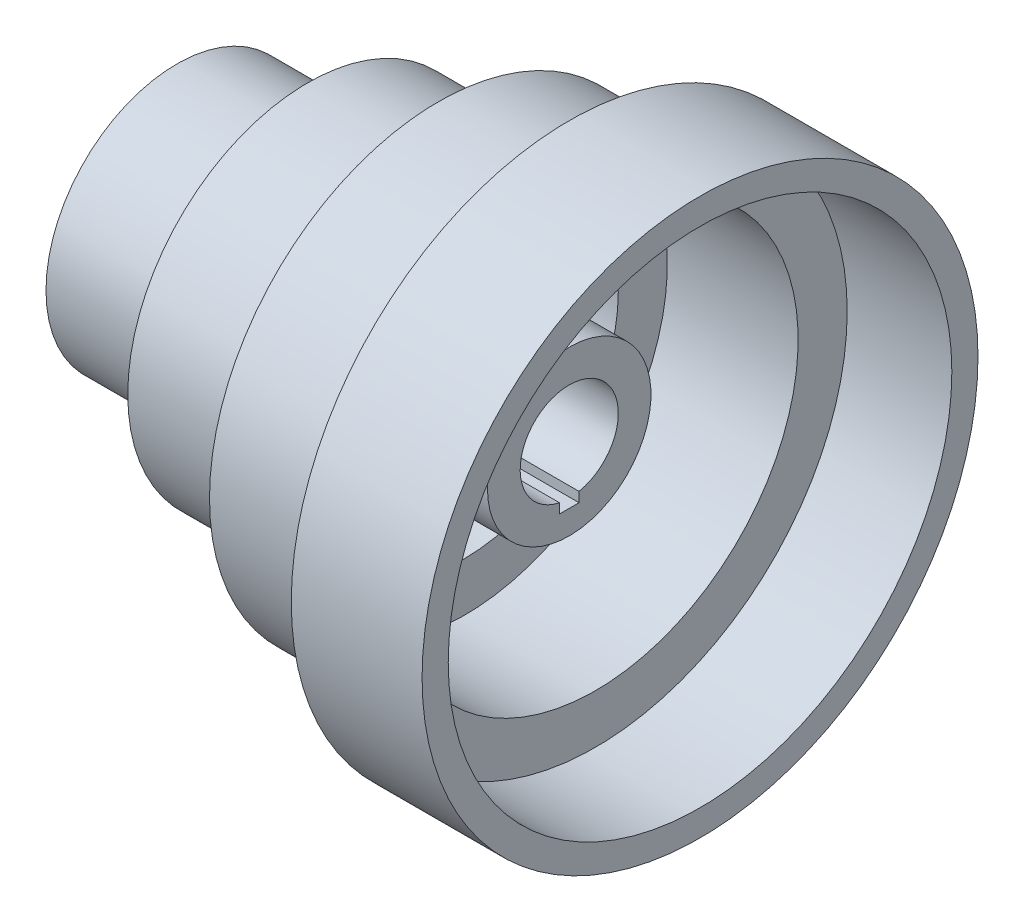
ISO-10303-21;
HEADER;
FILE_DESCRIPTION(('STEP AP214'),'2;1');
FILE_NAME('part.step','',(''),(''),'','','');
FILE_SCHEMA(('AUTOMOTIVE_DESIGN { 1 0 10303 214 1 1 1 1 }'));
ENDSEC;
DATA;
#1=APPLICATION_CONTEXT('core data for automotive mechanical design processes');
#2=APPLICATION_PROTOCOL_DEFINITION('international standard','automotive_design',2000,#1);
#3=PRODUCT_CONTEXT('',#1,'mechanical');
#4=PRODUCT('Part','Part','',(#3));
#5=PRODUCT_RELATED_PRODUCT_CATEGORY('part','',(#4));
#6=PRODUCT_DEFINITION_FORMATION('','',#4);
#7=PRODUCT_DEFINITION_CONTEXT('part definition',#1,'design');
#8=PRODUCT_DEFINITION('design','',#6,#7);
#9=PRODUCT_DEFINITION_SHAPE('','',#8);
#10=(LENGTH_UNIT() NAMED_UNIT(*) SI_UNIT(.MILLI.,.METRE.));
#11=(NAMED_UNIT(*) PLANE_ANGLE_UNIT() SI_UNIT($,.RADIAN.));
#12=(NAMED_UNIT(*) SI_UNIT($,.STERADIAN.) SOLID_ANGLE_UNIT());
#13=UNCERTAINTY_MEASURE_WITH_UNIT(LENGTH_MEASURE(1.E-05),#10,'distance_accuracy_value','');
#14=(GEOMETRIC_REPRESENTATION_CONTEXT(3) GLOBAL_UNCERTAINTY_ASSIGNED_CONTEXT((#13)) GLOBAL_UNIT_ASSIGNED_CONTEXT((#10,
#11,#12)) REPRESENTATION_CONTEXT('',''));
#15=CARTESIAN_POINT('',(0.,0.,0.));
#16=DIRECTION('',(0.,0.,1.));
#17=DIRECTION('',(1.,0.,0.));
#18=AXIS2_PLACEMENT_3D('',#15,#16,#17);
#19=CARTESIAN_POINT('',(-111.650485436893,0.,0.));
#20=DIRECTION('',(-1.,0.,0.));
#21=DIRECTION('',(0.,0.,1.));
#22=AXIS2_PLACEMENT_3D('',#19,#20,#21);
#23=CYLINDRICAL_SURFACE('',#22,25.);
#24=CARTESIAN_POINT('',(48.,0.,0.));
#25=DIRECTION('',(-1.,0.,0.));
#26=DIRECTION('',(0.,0.,1.));
#27=AXIS2_PLACEMENT_3D('',#24,#25,#26);
#28=CIRCLE('',#27,25.);
#29=CARTESIAN_POINT('',(48.,0.,25.));
#30=VERTEX_POINT('',#29);
#31=EDGE_CURVE('E88',#30,#30,#28,.T.);
#32=ORIENTED_EDGE('',*,*,#31,.F.);
#33=EDGE_LOOP('',(#32));
#34=FACE_BOUND('',#33,.T.);
#35=CARTESIAN_POINT('',(120.,0.,0.));
#36=DIRECTION('',(-1.,0.,0.));
#37=DIRECTION('',(0.,0.,1.));
#38=AXIS2_PLACEMENT_3D('',#35,#36,#37);
#39=CIRCLE('',#38,25.);
#40=CARTESIAN_POINT('',(120.,0.,25.));
#41=VERTEX_POINT('',#40);
#42=EDGE_CURVE('E147',#41,#41,#39,.T.);
#43=ORIENTED_EDGE('',*,*,#42,.T.);
#44=EDGE_LOOP('',(#43));
#45=FACE_BOUND('',#44,.T.);
#46=ADVANCED_FACE('F37',(#34,#45),#23,.T.);
#47=CARTESIAN_POINT('',(120.,15.,0.));
#48=DIRECTION('',(-1.,0.,0.));
#49=DIRECTION('',(0.,0.,1.));
#50=AXIS2_PLACEMENT_3D('',#47,#48,#49);
#51=PLANE('',#50);
#52=ORIENTED_EDGE('',*,*,#42,.F.);
#53=EDGE_LOOP('',(#52));
#54=FACE_BOUND('',#53,.T.);
#55=DIRECTION('',(0.,0.,1.));
#56=VECTOR('',#55,1.);
#57=CARTESIAN_POINT('',(120.,-17.6969384566991,0.));
#58=LINE('',#57,#56);
#59=CARTESIAN_POINT('',(120.,-17.6969384566991,-3.));
#60=VERTEX_POINT('',#59);
#61=CARTESIAN_POINT('',(120.,-17.6969384566991,3.));
#62=VERTEX_POINT('',#61);
#63=EDGE_CURVE('E77',#60,#62,#58,.T.);
#64=ORIENTED_EDGE('',*,*,#63,.T.);
#65=DIRECTION('',(0.,1.,0.));
#66=VECTOR('',#65,1.);
#67=CARTESIAN_POINT('',(120.,15.,3.));
#68=LINE('',#67,#66);
#69=CARTESIAN_POINT('',(120.,-14.6969384566991,3.));
#70=VERTEX_POINT('',#69);
#71=EDGE_CURVE('E82',#62,#70,#68,.T.);
#72=ORIENTED_EDGE('',*,*,#71,.T.);
#73=CARTESIAN_POINT('',(120.,0.,0.));
#74=DIRECTION('',(-1.,0.,0.));
#75=DIRECTION('',(0.,0.,1.));
#76=AXIS2_PLACEMENT_3D('',#73,#74,#75);
#77=CIRCLE('',#76,15.);
#78=CARTESIAN_POINT('',(120.,-14.6969384566991,-3.));
#79=VERTEX_POINT('',#78);
#80=EDGE_CURVE('E145',#70,#79,#77,.T.);
#81=ORIENTED_EDGE('',*,*,#80,.T.);
#82=DIRECTION('',(0.,-1.,0.));
#83=VECTOR('',#82,1.);
#84=CARTESIAN_POINT('',(120.,15.,-3.));
#85=LINE('',#84,#83);
#86=EDGE_CURVE('E96',#79,#60,#85,.T.);
#87=ORIENTED_EDGE('',*,*,#86,.T.);
#88=EDGE_LOOP('',(#64,#72,#81,#87));
#89=FACE_BOUND('',#88,.T.);
#90=ADVANCED_FACE('F95',(#54,#89),#51,.F.);
#91=CARTESIAN_POINT('',(-111.650485436893,0.,0.));
#92=DIRECTION('',(-1.,0.,0.));
#93=DIRECTION('',(0.,0.,1.));
#94=AXIS2_PLACEMENT_3D('',#91,#92,#93);
#95=CYLINDRICAL_SURFACE('',#94,15.);
#96=ORIENTED_EDGE('',*,*,#80,.F.);
#97=DIRECTION('',(-1.,0.,0.));
#98=VECTOR('',#97,1.);
#99=CARTESIAN_POINT('',(160.,-14.6969384566991,3.));
#100=LINE('',#99,#98);
#101=CARTESIAN_POINT('',(0.,-14.6969384566991,3.));
#102=VERTEX_POINT('',#101);
#103=EDGE_CURVE('E61',#70,#102,#100,.T.);
#104=ORIENTED_EDGE('',*,*,#103,.T.);
#105=CARTESIAN_POINT('',(0.,0.,0.));
#106=DIRECTION('',(-1.,0.,0.));
#107=DIRECTION('',(0.,0.,1.));
#108=AXIS2_PLACEMENT_3D('',#105,#106,#107);
#109=CIRCLE('',#108,15.);
#110=CARTESIAN_POINT('',(0.,-14.6969384566991,-3.));
#111=VERTEX_POINT('',#110);
#112=EDGE_CURVE('E40',#102,#111,#109,.T.);
#113=ORIENTED_EDGE('',*,*,#112,.T.);
#114=DIRECTION('',(-1.,0.,0.));
#115=VECTOR('',#114,1.);
#116=CARTESIAN_POINT('',(160.,-14.6969384566991,-3.));
#117=LINE('',#116,#115);
#118=EDGE_CURVE('E52',#79,#111,#117,.T.);
#119=ORIENTED_EDGE('',*,*,#118,.F.);
#120=EDGE_LOOP('',(#96,#104,#113,#119));
#121=FACE_BOUND('',#120,.T.);
#122=ADVANCED_FACE('F158',(#121),#95,.F.);
#123=CARTESIAN_POINT('',(0.,40.,0.));
#124=DIRECTION('',(1.,0.,0.));
#125=DIRECTION('',(0.,0.,-1.));
#126=AXIS2_PLACEMENT_3D('',#123,#124,#125);
#127=PLANE('',#126);
#128=ORIENTED_EDGE('',*,*,#112,.F.);
#129=DIRECTION('',(0.,-1.,0.));
#130=VECTOR('',#129,1.);
#131=CARTESIAN_POINT('',(0.,40.,3.));
#132=LINE('',#131,#130);
#133=CARTESIAN_POINT('',(0.,-17.6969384566991,3.));
#134=VERTEX_POINT('',#133);
#135=EDGE_CURVE('E11',#102,#134,#132,.T.);
#136=ORIENTED_EDGE('',*,*,#135,.T.);
#137=DIRECTION('',(0.,0.,-1.));
#138=VECTOR('',#137,1.);
#139=CARTESIAN_POINT('',(0.,-17.6969384566991,0.));
#140=LINE('',#139,#138);
#141=CARTESIAN_POINT('',(0.,-17.6969384566991,-3.));
#142=VERTEX_POINT('',#141);
#143=EDGE_CURVE('E45',#134,#142,#140,.T.);
#144=ORIENTED_EDGE('',*,*,#143,.T.);
#145=DIRECTION('',(0.,1.,0.));
#146=VECTOR('',#145,1.);
#147=CARTESIAN_POINT('',(0.,40.,-3.));
#148=LINE('',#147,#146);
#149=EDGE_CURVE('E150',#142,#111,#148,.T.);
#150=ORIENTED_EDGE('',*,*,#149,.T.);
#151=EDGE_LOOP('',(#128,#136,#144,#150));
#152=FACE_BOUND('',#151,.T.);
#153=CARTESIAN_POINT('',(0.,0.,0.));
#154=DIRECTION('',(-1.,0.,0.));
#155=DIRECTION('',(0.,0.,1.));
#156=AXIS2_PLACEMENT_3D('',#153,#154,#155);
#157=CIRCLE('',#156,40.);
#158=CARTESIAN_POINT('',(0.,0.,40.));
#159=VERTEX_POINT('',#158);
#160=EDGE_CURVE('E142',#159,#159,#157,.T.);
#161=ORIENTED_EDGE('',*,*,#160,.T.);
#162=EDGE_LOOP('',(#161));
#163=FACE_BOUND('',#162,.T.);
#164=ADVANCED_FACE('F154',(#152,#163),#127,.F.);
#165=CARTESIAN_POINT('',(-111.650485436893,0.,0.));
#166=DIRECTION('',(-1.,0.,0.));
#167=DIRECTION('',(0.,0.,1.));
#168=AXIS2_PLACEMENT_3D('',#165,#166,#167);
#169=CYLINDRICAL_SURFACE('',#168,40.);
#170=ORIENTED_EDGE('',*,*,#160,.F.);
#171=EDGE_LOOP('',(#170));
#172=FACE_BOUND('',#171,.T.);
#173=CARTESIAN_POINT('',(40.,0.,0.));
#174=DIRECTION('',(-1.,0.,0.));
#175=DIRECTION('',(0.,0.,1.));
#176=AXIS2_PLACEMENT_3D('',#173,#174,#175);
#177=CIRCLE('',#176,40.);
#178=CARTESIAN_POINT('',(40.,0.,40.));
#179=VERTEX_POINT('',#178);
#180=EDGE_CURVE('E139',#179,#179,#177,.T.);
#181=ORIENTED_EDGE('',*,*,#180,.T.);
#182=EDGE_LOOP('',(#181));
#183=FACE_BOUND('',#182,.T.);
#184=ADVANCED_FACE('F235',(#172,#183),#169,.T.);
#185=CARTESIAN_POINT('',(40.,55.,0.));
#186=DIRECTION('',(1.,0.,0.));
#187=DIRECTION('',(0.,0.,-1.));
#188=AXIS2_PLACEMENT_3D('',#185,#186,#187);
#189=PLANE('',#188);
#190=ORIENTED_EDGE('',*,*,#180,.F.);
#191=EDGE_LOOP('',(#190));
#192=FACE_BOUND('',#191,.T.);
#193=CARTESIAN_POINT('',(40.,0.,0.));
#194=DIRECTION('',(-1.,0.,0.));
#195=DIRECTION('',(0.,0.,1.));
#196=AXIS2_PLACEMENT_3D('',#193,#194,#195);
#197=CIRCLE('',#196,55.);
#198=CARTESIAN_POINT('',(40.,0.,55.));
#199=VERTEX_POINT('',#198);
#200=EDGE_CURVE('E136',#199,#199,#197,.T.);
#201=ORIENTED_EDGE('',*,*,#200,.T.);
#202=EDGE_LOOP('',(#201));
#203=FACE_BOUND('',#202,.T.);
#204=ADVANCED_FACE('F231',(#192,#203),#189,.F.);
#205=CARTESIAN_POINT('',(-111.650485436893,0.,0.));
#206=DIRECTION('',(-1.,0.,0.));
#207=DIRECTION('',(0.,0.,1.));
#208=AXIS2_PLACEMENT_3D('',#205,#206,#207);
#209=CYLINDRICAL_SURFACE('',#208,55.);
#210=ORIENTED_EDGE('',*,*,#200,.F.);
#211=EDGE_LOOP('',(#210));
#212=FACE_BOUND('',#211,.T.);
#213=CARTESIAN_POINT('',(80.,0.,0.));
#214=DIRECTION('',(-1.,0.,0.));
#215=DIRECTION('',(0.,0.,1.));
#216=AXIS2_PLACEMENT_3D('',#213,#214,#215);
#217=CIRCLE('',#216,55.);
#218=CARTESIAN_POINT('',(80.,0.,55.));
#219=VERTEX_POINT('',#218);
#220=EDGE_CURVE('E133',#219,#219,#217,.T.);
#221=ORIENTED_EDGE('',*,*,#220,.T.);
#222=EDGE_LOOP('',(#221));
#223=FACE_BOUND('',#222,.T.);
#224=ADVANCED_FACE('F227',(#212,#223),#209,.T.);
#225=CARTESIAN_POINT('',(80.,70.,0.));
#226=DIRECTION('',(1.,0.,0.));
#227=DIRECTION('',(0.,0.,-1.));
#228=AXIS2_PLACEMENT_3D('',#225,#226,#227);
#229=PLANE('',#228);
#230=ORIENTED_EDGE('',*,*,#220,.F.);
#231=EDGE_LOOP('',(#230));
#232=FACE_BOUND('',#231,.T.);
#233=CARTESIAN_POINT('',(80.,0.,0.));
#234=DIRECTION('',(-1.,0.,0.));
#235=DIRECTION('',(0.,0.,1.));
#236=AXIS2_PLACEMENT_3D('',#233,#234,#235);
#237=CIRCLE('',#236,70.);
#238=CARTESIAN_POINT('',(80.,0.,70.));
#239=VERTEX_POINT('',#238);
#240=EDGE_CURVE('E130',#239,#239,#237,.T.);
#241=ORIENTED_EDGE('',*,*,#240,.T.);
#242=EDGE_LOOP('',(#241));
#243=FACE_BOUND('',#242,.T.);
#244=ADVANCED_FACE('F223',(#232,#243),#229,.F.);
#245=CARTESIAN_POINT('',(-111.650485436893,0.,0.));
#246=DIRECTION('',(-1.,0.,0.));
#247=DIRECTION('',(0.,0.,1.));
#248=AXIS2_PLACEMENT_3D('',#245,#246,#247);
#249=CYLINDRICAL_SURFACE('',#248,70.);
#250=ORIENTED_EDGE('',*,*,#240,.F.);
#251=EDGE_LOOP('',(#250));
#252=FACE_BOUND('',#251,.T.);
#253=CARTESIAN_POINT('',(120.,0.,0.));
#254=DIRECTION('',(-1.,0.,0.));
#255=DIRECTION('',(0.,0.,1.));
#256=AXIS2_PLACEMENT_3D('',#253,#254,#255);
#257=CIRCLE('',#256,70.);
#258=CARTESIAN_POINT('',(120.,0.,70.));
#259=VERTEX_POINT('',#258);
#260=EDGE_CURVE('E127',#259,#259,#257,.T.);
#261=ORIENTED_EDGE('',*,*,#260,.T.);
#262=EDGE_LOOP('',(#261));
#263=FACE_BOUND('',#262,.T.);
#264=ADVANCED_FACE('F219',(#252,#263),#249,.T.);
#265=CARTESIAN_POINT('',(120.,85.,0.));
#266=DIRECTION('',(1.,0.,0.));
#267=DIRECTION('',(0.,0.,-1.));
#268=AXIS2_PLACEMENT_3D('',#265,#266,#267);
#269=PLANE('',#268);
#270=ORIENTED_EDGE('',*,*,#260,.F.);
#271=EDGE_LOOP('',(#270));
#272=FACE_BOUND('',#271,.T.);
#273=CARTESIAN_POINT('',(120.,0.,0.));
#274=DIRECTION('',(-1.,0.,0.));
#275=DIRECTION('',(0.,0.,1.));
#276=AXIS2_PLACEMENT_3D('',#273,#274,#275);
#277=CIRCLE('',#276,85.);
#278=CARTESIAN_POINT('',(120.,0.,85.));
#279=VERTEX_POINT('',#278);
#280=EDGE_CURVE('E124',#279,#279,#277,.T.);
#281=ORIENTED_EDGE('',*,*,#280,.T.);
#282=EDGE_LOOP('',(#281));
#283=FACE_BOUND('',#282,.T.);
#284=ADVANCED_FACE('F215',(#272,#283),#269,.F.);
#285=CARTESIAN_POINT('',(-111.650485436893,0.,0.));
#286=DIRECTION('',(-1.,0.,0.));
#287=DIRECTION('',(0.,0.,1.));
#288=AXIS2_PLACEMENT_3D('',#285,#286,#287);
#289=CYLINDRICAL_SURFACE('',#288,85.);
#290=ORIENTED_EDGE('',*,*,#280,.F.);
#291=EDGE_LOOP('',(#290));
#292=FACE_BOUND('',#291,.T.);
#293=CARTESIAN_POINT('',(160.,0.,0.));
#294=DIRECTION('',(-1.,0.,0.));
#295=DIRECTION('',(0.,0.,1.));
#296=AXIS2_PLACEMENT_3D('',#293,#294,#295);
#297=CIRCLE('',#296,85.);
#298=CARTESIAN_POINT('',(160.,0.,85.));
#299=VERTEX_POINT('',#298);
#300=EDGE_CURVE('E121',#299,#299,#297,.T.);
#301=ORIENTED_EDGE('',*,*,#300,.T.);
#302=EDGE_LOOP('',(#301));
#303=FACE_BOUND('',#302,.T.);
#304=ADVANCED_FACE('F211',(#292,#303),#289,.T.);
#305=CARTESIAN_POINT('',(160.,77.,0.));
#306=DIRECTION('',(-1.,0.,0.));
#307=DIRECTION('',(0.,0.,1.));
#308=AXIS2_PLACEMENT_3D('',#305,#306,#307);
#309=PLANE('',#308);
#310=ORIENTED_EDGE('',*,*,#300,.F.);
#311=EDGE_LOOP('',(#310));
#312=FACE_BOUND('',#311,.T.);
#313=CARTESIAN_POINT('',(160.,0.,0.));
#314=DIRECTION('',(-1.,0.,0.));
#315=DIRECTION('',(0.,0.,1.));
#316=AXIS2_PLACEMENT_3D('',#313,#314,#315);
#317=CIRCLE('',#316,77.);
#318=CARTESIAN_POINT('',(160.,0.,77.));
#319=VERTEX_POINT('',#318);
#320=EDGE_CURVE('E118',#319,#319,#317,.T.);
#321=ORIENTED_EDGE('',*,*,#320,.T.);
#322=EDGE_LOOP('',(#321));
#323=FACE_BOUND('',#322,.T.);
#324=ADVANCED_FACE('F207',(#312,#323),#309,.F.);
#325=CARTESIAN_POINT('',(-111.650485436893,0.,0.));
#326=DIRECTION('',(-1.,0.,0.));
#327=DIRECTION('',(0.,0.,1.));
#328=AXIS2_PLACEMENT_3D('',#325,#326,#327);
#329=CYLINDRICAL_SURFACE('',#328,77.);
#330=ORIENTED_EDGE('',*,*,#320,.F.);
#331=EDGE_LOOP('',(#330));
#332=FACE_BOUND('',#331,.T.);
#333=CARTESIAN_POINT('',(128.,0.,0.));
#334=DIRECTION('',(-1.,0.,0.));
#335=DIRECTION('',(0.,0.,1.));
#336=AXIS2_PLACEMENT_3D('',#333,#334,#335);
#337=CIRCLE('',#336,77.);
#338=CARTESIAN_POINT('',(128.,0.,77.));
#339=VERTEX_POINT('',#338);
#340=EDGE_CURVE('E115',#339,#339,#337,.T.);
#341=ORIENTED_EDGE('',*,*,#340,.T.);
#342=EDGE_LOOP('',(#341));
#343=FACE_BOUND('',#342,.T.);
#344=ADVANCED_FACE('F203',(#332,#343),#329,.F.);
#345=CARTESIAN_POINT('',(128.,62.,0.));
#346=DIRECTION('',(-1.,0.,0.));
#347=DIRECTION('',(0.,0.,1.));
#348=AXIS2_PLACEMENT_3D('',#345,#346,#347);
#349=PLANE('',#348);
#350=ORIENTED_EDGE('',*,*,#340,.F.);
#351=EDGE_LOOP('',(#350));
#352=FACE_BOUND('',#351,.T.);
#353=CARTESIAN_POINT('',(128.,0.,0.));
#354=DIRECTION('',(-1.,0.,0.));
#355=DIRECTION('',(0.,0.,1.));
#356=AXIS2_PLACEMENT_3D('',#353,#354,#355);
#357=CIRCLE('',#356,62.);
#358=CARTESIAN_POINT('',(128.,0.,62.));
#359=VERTEX_POINT('',#358);
#360=EDGE_CURVE('E112',#359,#359,#357,.T.);
#361=ORIENTED_EDGE('',*,*,#360,.T.);
#362=EDGE_LOOP('',(#361));
#363=FACE_BOUND('',#362,.T.);
#364=ADVANCED_FACE('F199',(#352,#363),#349,.F.);
#365=CARTESIAN_POINT('',(-111.650485436893,0.,0.));
#366=DIRECTION('',(-1.,0.,0.));
#367=DIRECTION('',(0.,0.,1.));
#368=AXIS2_PLACEMENT_3D('',#365,#366,#367);
#369=CYLINDRICAL_SURFACE('',#368,62.);
#370=ORIENTED_EDGE('',*,*,#360,.F.);
#371=EDGE_LOOP('',(#370));
#372=FACE_BOUND('',#371,.T.);
#373=CARTESIAN_POINT('',(88.,0.,0.));
#374=DIRECTION('',(-1.,0.,0.));
#375=DIRECTION('',(0.,0.,1.));
#376=AXIS2_PLACEMENT_3D('',#373,#374,#375);
#377=CIRCLE('',#376,62.);
#378=CARTESIAN_POINT('',(88.,0.,62.));
#379=VERTEX_POINT('',#378);
#380=EDGE_CURVE('E109',#379,#379,#377,.T.);
#381=ORIENTED_EDGE('',*,*,#380,.T.);
#382=EDGE_LOOP('',(#381));
#383=FACE_BOUND('',#382,.T.);
#384=ADVANCED_FACE('F195',(#372,#383),#369,.F.);
#385=CARTESIAN_POINT('',(88.,47.,0.));
#386=DIRECTION('',(-1.,0.,0.));
#387=DIRECTION('',(0.,0.,1.));
#388=AXIS2_PLACEMENT_3D('',#385,#386,#387);
#389=PLANE('',#388);
#390=ORIENTED_EDGE('',*,*,#380,.F.);
#391=EDGE_LOOP('',(#390));
#392=FACE_BOUND('',#391,.T.);
#393=CARTESIAN_POINT('',(88.,0.,0.));
#394=DIRECTION('',(-1.,0.,0.));
#395=DIRECTION('',(0.,0.,1.));
#396=AXIS2_PLACEMENT_3D('',#393,#394,#395);
#397=CIRCLE('',#396,47.);
#398=CARTESIAN_POINT('',(88.,0.,47.));
#399=VERTEX_POINT('',#398);
#400=EDGE_CURVE('E106',#399,#399,#397,.T.);
#401=ORIENTED_EDGE('',*,*,#400,.T.);
#402=EDGE_LOOP('',(#401));
#403=FACE_BOUND('',#402,.T.);
#404=ADVANCED_FACE('F188',(#392,#403),#389,.F.);
#405=CARTESIAN_POINT('',(-111.650485436893,0.,0.));
#406=DIRECTION('',(-1.,0.,0.));
#407=DIRECTION('',(0.,0.,1.));
#408=AXIS2_PLACEMENT_3D('',#405,#406,#407);
#409=CYLINDRICAL_SURFACE('',#408,47.);
#410=ORIENTED_EDGE('',*,*,#400,.F.);
#411=EDGE_LOOP('',(#410));
#412=FACE_BOUND('',#411,.T.);
#413=CARTESIAN_POINT('',(48.,0.,0.));
#414=DIRECTION('',(-1.,0.,0.));
#415=DIRECTION('',(0.,0.,1.));
#416=AXIS2_PLACEMENT_3D('',#413,#414,#415);
#417=CIRCLE('',#416,47.);
#418=CARTESIAN_POINT('',(48.,0.,47.));
#419=VERTEX_POINT('',#418);
#420=EDGE_CURVE('E103',#419,#419,#417,.T.);
#421=ORIENTED_EDGE('',*,*,#420,.T.);
#422=EDGE_LOOP('',(#421));
#423=FACE_BOUND('',#422,.T.);
#424=ADVANCED_FACE('F181',(#412,#423),#409,.F.);
#425=CARTESIAN_POINT('',(48.,25.,0.));
#426=DIRECTION('',(-1.,0.,0.));
#427=DIRECTION('',(0.,0.,1.));
#428=AXIS2_PLACEMENT_3D('',#425,#426,#427);
#429=PLANE('',#428);
#430=ORIENTED_EDGE('',*,*,#420,.F.);
#431=EDGE_LOOP('',(#430));
#432=FACE_BOUND('',#431,.T.);
#433=ORIENTED_EDGE('',*,*,#31,.T.);
#434=EDGE_LOOP('',(#433));
#435=FACE_BOUND('',#434,.T.);
#436=ADVANCED_FACE('F179',(#432,#435),#429,.F.);
#437=CARTESIAN_POINT('',(160.,-17.6969384566991,3.));
#438=DIRECTION('',(0.,0.,1.));
#439=DIRECTION('',(1.,0.,0.));
#440=AXIS2_PLACEMENT_3D('',#437,#438,#439);
#441=PLANE('',#440);
#442=DIRECTION('',(-1.,0.,0.));
#443=VECTOR('',#442,1.);
#444=CARTESIAN_POINT('',(160.,-17.6969384566991,3.));
#445=LINE('',#444,#443);
#446=EDGE_CURVE('E84',#62,#134,#445,.T.);
#447=ORIENTED_EDGE('',*,*,#446,.T.);
#448=ORIENTED_EDGE('',*,*,#135,.F.);
#449=ORIENTED_EDGE('',*,*,#103,.F.);
#450=ORIENTED_EDGE('',*,*,#71,.F.);
#451=EDGE_LOOP('',(#447,#448,#449,#450));
#452=FACE_BOUND('',#451,.T.);
#453=ADVANCED_FACE('F83',(#452),#441,.F.);
#454=CARTESIAN_POINT('',(160.,-17.6969384566991,-3.));
#455=DIRECTION('',(0.,-1.,0.));
#456=DIRECTION('',(0.,0.,-1.));
#457=AXIS2_PLACEMENT_3D('',#454,#455,#456);
#458=PLANE('',#457);
#459=DIRECTION('',(-1.,0.,0.));
#460=VECTOR('',#459,1.);
#461=CARTESIAN_POINT('',(160.,-17.6969384566991,-3.));
#462=LINE('',#461,#460);
#463=EDGE_CURVE('E92',#60,#142,#462,.T.);
#464=ORIENTED_EDGE('',*,*,#463,.T.);
#465=ORIENTED_EDGE('',*,*,#143,.F.);
#466=ORIENTED_EDGE('',*,*,#446,.F.);
#467=ORIENTED_EDGE('',*,*,#63,.F.);
#468=EDGE_LOOP('',(#464,#465,#466,#467));
#469=FACE_BOUND('',#468,.T.);
#470=ADVANCED_FACE('F90',(#469),#458,.F.);
#471=CARTESIAN_POINT('',(160.,-14.6969384566991,-3.));
#472=DIRECTION('',(0.,0.,-1.));
#473=DIRECTION('',(-1.,0.,0.));
#474=AXIS2_PLACEMENT_3D('',#471,#472,#473);
#475=PLANE('',#474);
#476=ORIENTED_EDGE('',*,*,#118,.T.);
#477=ORIENTED_EDGE('',*,*,#149,.F.);
#478=ORIENTED_EDGE('',*,*,#463,.F.);
#479=ORIENTED_EDGE('',*,*,#86,.F.);
#480=EDGE_LOOP('',(#476,#477,#478,#479));
#481=FACE_BOUND('',#480,.T.);
#482=ADVANCED_FACE('F161',(#481),#475,.F.);
#483=CLOSED_SHELL('',(#46,#90,#122,#164,#184,#204,#224,#244,#264,#284,#304,#324,#344,#364,#384,
#404,#424,#436,#453,#470,#482));
#484=MANIFOLD_SOLID_BREP('B2',#483);
#485=ADVANCED_BREP_SHAPE_REPRESENTATION('',(#18,#484),#14);
#486=SHAPE_DEFINITION_REPRESENTATION(#9,#485);
ENDSEC;
END-ISO-10303-21;
